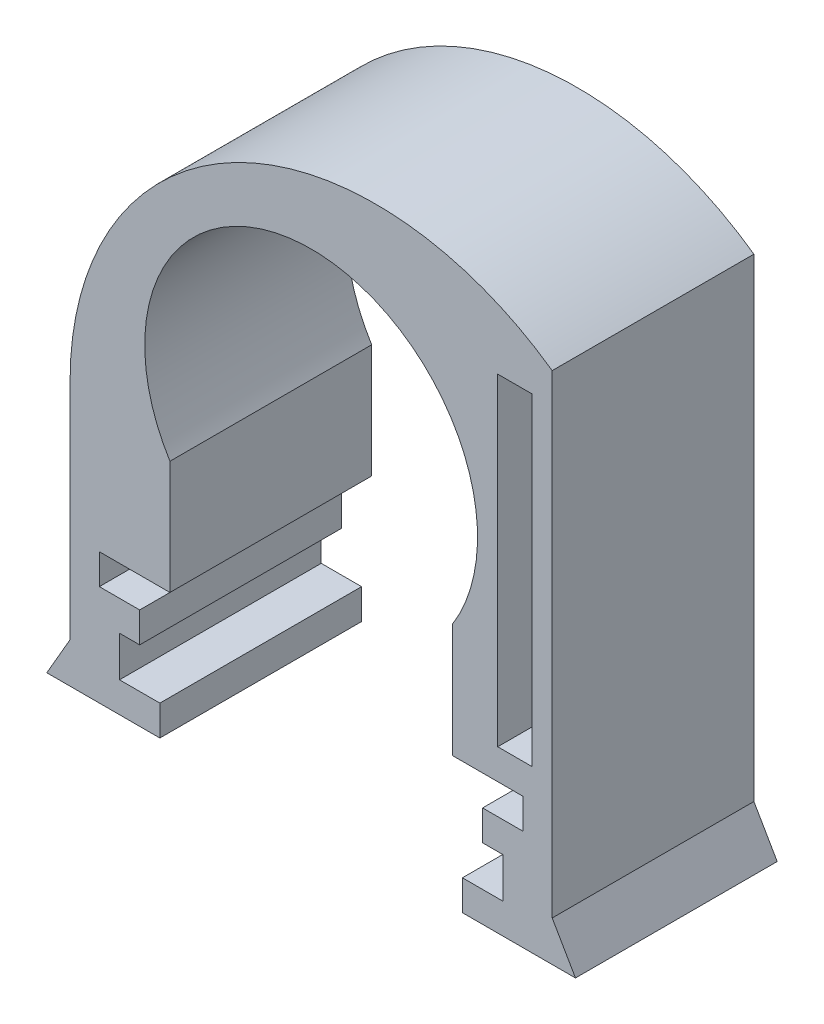
ISO-10303-21;
HEADER;
FILE_DESCRIPTION(('STEP AP214'),'2;1');
FILE_NAME('part.step','',(''),(''),'','','');
FILE_SCHEMA(('AUTOMOTIVE_DESIGN { 1 0 10303 214 1 1 1 1 }'));
ENDSEC;
DATA;
#1=APPLICATION_CONTEXT('core data for automotive mechanical design processes');
#2=APPLICATION_PROTOCOL_DEFINITION('international standard','automotive_design',2000,#1);
#3=PRODUCT_CONTEXT('',#1,'mechanical');
#4=PRODUCT('Part','Part','',(#3));
#5=PRODUCT_RELATED_PRODUCT_CATEGORY('part','',(#4));
#6=PRODUCT_DEFINITION_FORMATION('','',#4);
#7=PRODUCT_DEFINITION_CONTEXT('part definition',#1,'design');
#8=PRODUCT_DEFINITION('design','',#6,#7);
#9=PRODUCT_DEFINITION_SHAPE('','',#8);
#10=(LENGTH_UNIT() NAMED_UNIT(*) SI_UNIT(.MILLI.,.METRE.));
#11=(NAMED_UNIT(*) PLANE_ANGLE_UNIT() SI_UNIT($,.RADIAN.));
#12=(NAMED_UNIT(*) SI_UNIT($,.STERADIAN.) SOLID_ANGLE_UNIT());
#13=UNCERTAINTY_MEASURE_WITH_UNIT(LENGTH_MEASURE(1.E-05),#10,'distance_accuracy_value','');
#14=(GEOMETRIC_REPRESENTATION_CONTEXT(3) GLOBAL_UNCERTAINTY_ASSIGNED_CONTEXT((#13)) GLOBAL_UNIT_ASSIGNED_CONTEXT((#10,
#11,#12)) REPRESENTATION_CONTEXT('',''));
#15=CARTESIAN_POINT('',(0.,0.,0.));
#16=DIRECTION('',(0.,0.,1.));
#17=DIRECTION('',(1.,0.,0.));
#18=AXIS2_PLACEMENT_3D('',#15,#16,#17);
#19=CARTESIAN_POINT('',(11.95,-32.4920206421125,10.));
#20=DIRECTION('',(-1.,0.,0.));
#21=DIRECTION('',(0.,0.,1.));
#22=AXIS2_PLACEMENT_3D('',#19,#20,#21);
#23=PLANE('',#22);
#24=DIRECTION('',(0.,1.,0.));
#25=VECTOR('',#24,1.);
#26=CARTESIAN_POINT('',(11.95,-32.4920206421125,0.));
#27=LINE('',#26,#25);
#28=CARTESIAN_POINT('',(11.95,-14.5,0.));
#29=VERTEX_POINT('',#28);
#30=CARTESIAN_POINT('',(11.95,9.,0.));
#31=VERTEX_POINT('',#30);
#32=EDGE_CURVE('E278',#29,#31,#27,.T.);
#33=ORIENTED_EDGE('',*,*,#32,.T.);
#34=DIRECTION('',(0.,0.,-1.));
#35=VECTOR('',#34,1.);
#36=CARTESIAN_POINT('',(11.95,9.,10.));
#37=LINE('',#36,#35);
#38=CARTESIAN_POINT('',(11.95,9.,10.));
#39=VERTEX_POINT('',#38);
#40=EDGE_CURVE('E11',#39,#31,#37,.T.);
#41=ORIENTED_EDGE('',*,*,#40,.F.);
#42=DIRECTION('',(0.,1.,0.));
#43=VECTOR('',#42,1.);
#44=CARTESIAN_POINT('',(11.95,-32.4920206421125,10.));
#45=LINE('',#44,#43);
#46=CARTESIAN_POINT('',(11.95,-14.5,10.));
#47=VERTEX_POINT('',#46);
#48=EDGE_CURVE('E537',#47,#39,#45,.T.);
#49=ORIENTED_EDGE('',*,*,#48,.F.);
#50=DIRECTION('',(0.,0.,-1.));
#51=VECTOR('',#50,1.);
#52=CARTESIAN_POINT('',(11.95,-14.5,10.));
#53=LINE('',#52,#51);
#54=EDGE_CURVE('E344',#47,#29,#53,.T.);
#55=ORIENTED_EDGE('',*,*,#54,.T.);
#56=EDGE_LOOP('',(#33,#41,#49,#55));
#57=FACE_BOUND('',#56,.T.);
#58=ADVANCED_FACE('F33',(#57),#23,.F.);
#59=CARTESIAN_POINT('',(3.20553460715207,-3.37839061517565,10.));
#60=DIRECTION('',(0.,0.,-1.));
#61=DIRECTION('',(-1.,0.,0.));
#62=AXIS2_PLACEMENT_3D('',#59,#60,#61);
#63=CYLINDRICAL_SURFACE('',#62,15.1555346071521);
#64=CARTESIAN_POINT('',(3.20553460715207,-3.37839061517565,0.));
#65=DIRECTION('',(0.,0.,1.));
#66=DIRECTION('',(1.,0.,0.));
#67=AXIS2_PLACEMENT_3D('',#64,#65,#66);
#68=CIRCLE('',#67,15.1555346071521);
#69=CARTESIAN_POINT('',(-11.95,-3.37839061517565,0.));
#70=VERTEX_POINT('',#69);
#71=EDGE_CURVE('E281',#31,#70,#68,.T.);
#72=ORIENTED_EDGE('',*,*,#71,.T.);
#73=DIRECTION('',(0.,0.,-1.));
#74=VECTOR('',#73,1.);
#75=CARTESIAN_POINT('',(-11.95,-3.37839061517565,10.));
#76=LINE('',#75,#74);
#77=CARTESIAN_POINT('',(-11.95,-3.37839061517565,10.));
#78=VERTEX_POINT('',#77);
#79=EDGE_CURVE('E43',#78,#70,#76,.T.);
#80=ORIENTED_EDGE('',*,*,#79,.F.);
#81=CARTESIAN_POINT('',(3.20553460715207,-3.37839061517565,10.));
#82=DIRECTION('',(0.,0.,1.));
#83=DIRECTION('',(1.,0.,0.));
#84=AXIS2_PLACEMENT_3D('',#81,#82,#83);
#85=CIRCLE('',#84,15.1555346071521);
#86=EDGE_CURVE('E539',#39,#78,#85,.T.);
#87=ORIENTED_EDGE('',*,*,#86,.F.);
#88=ORIENTED_EDGE('',*,*,#40,.T.);
#89=EDGE_LOOP('',(#72,#80,#87,#88));
#90=FACE_BOUND('',#89,.T.);
#91=ADVANCED_FACE('F426',(#90),#63,.T.);
#92=CARTESIAN_POINT('',(-11.95,-32.4920206421125,10.));
#93=DIRECTION('',(-1.,0.,0.));
#94=DIRECTION('',(0.,-1.,0.));
#95=AXIS2_PLACEMENT_3D('',#92,#93,#94);
#96=PLANE('',#95);
#97=DIRECTION('',(0.,1.,0.));
#98=VECTOR('',#97,1.);
#99=CARTESIAN_POINT('',(-11.95,-32.4920206421125,0.));
#100=LINE('',#99,#98);
#101=CARTESIAN_POINT('',(-11.95,-14.5,0.));
#102=VERTEX_POINT('',#101);
#103=EDGE_CURVE('E284',#102,#70,#100,.T.);
#104=ORIENTED_EDGE('',*,*,#103,.F.);
#105=DIRECTION('',(0.,0.,-1.));
#106=VECTOR('',#105,1.);
#107=CARTESIAN_POINT('',(-11.95,-14.5,10.));
#108=LINE('',#107,#106);
#109=CARTESIAN_POINT('',(-11.95,-14.5,10.));
#110=VERTEX_POINT('',#109);
#111=EDGE_CURVE('E392',#110,#102,#108,.T.);
#112=ORIENTED_EDGE('',*,*,#111,.F.);
#113=DIRECTION('',(0.,1.,0.));
#114=VECTOR('',#113,1.);
#115=CARTESIAN_POINT('',(-11.95,-32.4920206421125,10.));
#116=LINE('',#115,#114);
#117=EDGE_CURVE('E541',#110,#78,#116,.T.);
#118=ORIENTED_EDGE('',*,*,#117,.T.);
#119=ORIENTED_EDGE('',*,*,#79,.T.);
#120=EDGE_LOOP('',(#104,#112,#118,#119));
#121=FACE_BOUND('',#120,.T.);
#122=ADVANCED_FACE('F432',(#121),#96,.T.);
#123=CARTESIAN_POINT('',(-16.7532734707417,-22.8195136939723,10.));
#124=DIRECTION('',(-0.866025403784437,0.500000000000004,0.));
#125=DIRECTION('',(-0.500000000000004,-0.866025403784437,0.));
#126=AXIS2_PLACEMENT_3D('',#123,#124,#125);
#127=PLANE('',#126);
#128=DIRECTION('',(0.500000000000004,0.866025403784437,0.));
#129=VECTOR('',#128,1.);
#130=CARTESIAN_POINT('',(-16.7532734707417,-22.8195136939723,0.));
#131=LINE('',#130,#129);
#132=CARTESIAN_POINT('',(-13.1047005383793,-16.5,0.));
#133=VERTEX_POINT('',#132);
#134=EDGE_CURVE('E287',#133,#102,#131,.T.);
#135=ORIENTED_EDGE('',*,*,#134,.F.);
#136=DIRECTION('',(0.,0.,-1.));
#137=VECTOR('',#136,1.);
#138=CARTESIAN_POINT('',(-13.1047005383793,-16.5,10.));
#139=LINE('',#138,#137);
#140=CARTESIAN_POINT('',(-13.1047005383793,-16.5,10.));
#141=VERTEX_POINT('',#140);
#142=EDGE_CURVE('E390',#141,#133,#139,.T.);
#143=ORIENTED_EDGE('',*,*,#142,.F.);
#144=DIRECTION('',(0.500000000000004,0.866025403784437,0.));
#145=VECTOR('',#144,1.);
#146=CARTESIAN_POINT('',(-16.7532734707417,-22.8195136939723,10.));
#147=LINE('',#146,#145);
#148=EDGE_CURVE('E544',#141,#110,#147,.T.);
#149=ORIENTED_EDGE('',*,*,#148,.T.);
#150=ORIENTED_EDGE('',*,*,#111,.T.);
#151=EDGE_LOOP('',(#135,#143,#149,#150));
#152=FACE_BOUND('',#151,.T.);
#153=ADVANCED_FACE('F438',(#152),#127,.T.);
#154=CARTESIAN_POINT('',(0.,-16.5,10.));
#155=DIRECTION('',(0.,-1.,0.));
#156=DIRECTION('',(0.,0.,-1.));
#157=AXIS2_PLACEMENT_3D('',#154,#155,#156);
#158=PLANE('',#157);
#159=DIRECTION('',(-1.,0.,0.));
#160=VECTOR('',#159,1.);
#161=CARTESIAN_POINT('',(0.,-16.5,0.));
#162=LINE('',#161,#160);
#163=CARTESIAN_POINT('',(-7.5,-16.5,0.));
#164=VERTEX_POINT('',#163);
#165=EDGE_CURVE('E290',#164,#133,#162,.T.);
#166=ORIENTED_EDGE('',*,*,#165,.F.);
#167=DIRECTION('',(0.,0.,-1.));
#168=VECTOR('',#167,1.);
#169=CARTESIAN_POINT('',(-7.5,-16.5,10.));
#170=LINE('',#169,#168);
#171=CARTESIAN_POINT('',(-7.5,-16.5,10.));
#172=VERTEX_POINT('',#171);
#173=EDGE_CURVE('E388',#172,#164,#170,.T.);
#174=ORIENTED_EDGE('',*,*,#173,.F.);
#175=DIRECTION('',(-1.,0.,0.));
#176=VECTOR('',#175,1.);
#177=CARTESIAN_POINT('',(0.,-16.5,10.));
#178=LINE('',#177,#176);
#179=EDGE_CURVE('E547',#172,#141,#178,.T.);
#180=ORIENTED_EDGE('',*,*,#179,.T.);
#181=ORIENTED_EDGE('',*,*,#142,.T.);
#182=EDGE_LOOP('',(#166,#174,#180,#181));
#183=FACE_BOUND('',#182,.T.);
#184=ADVANCED_FACE('F442',(#183),#158,.T.);
#185=CARTESIAN_POINT('',(-7.5,-32.4920206421125,10.));
#186=DIRECTION('',(1.,0.,0.));
#187=DIRECTION('',(0.,0.,-1.));
#188=AXIS2_PLACEMENT_3D('',#185,#186,#187);
#189=PLANE('',#188);
#190=DIRECTION('',(0.,-1.,0.));
#191=VECTOR('',#190,1.);
#192=CARTESIAN_POINT('',(-7.5,-32.4920206421125,0.));
#193=LINE('',#192,#191);
#194=CARTESIAN_POINT('',(-7.5,-15.,0.));
#195=VERTEX_POINT('',#194);
#196=EDGE_CURVE('E293',#195,#164,#193,.T.);
#197=ORIENTED_EDGE('',*,*,#196,.F.);
#198=DIRECTION('',(0.,0.,-1.));
#199=VECTOR('',#198,1.);
#200=CARTESIAN_POINT('',(-7.5,-15.,10.));
#201=LINE('',#200,#199);
#202=CARTESIAN_POINT('',(-7.5,-15.,10.));
#203=VERTEX_POINT('',#202);
#204=EDGE_CURVE('E386',#203,#195,#201,.T.);
#205=ORIENTED_EDGE('',*,*,#204,.F.);
#206=DIRECTION('',(0.,-1.,0.));
#207=VECTOR('',#206,1.);
#208=CARTESIAN_POINT('',(-7.5,-32.4920206421125,10.));
#209=LINE('',#208,#207);
#210=EDGE_CURVE('E550',#203,#172,#209,.T.);
#211=ORIENTED_EDGE('',*,*,#210,.T.);
#212=ORIENTED_EDGE('',*,*,#173,.T.);
#213=EDGE_LOOP('',(#197,#205,#211,#212));
#214=FACE_BOUND('',#213,.T.);
#215=ADVANCED_FACE('F446',(#214),#189,.T.);
#216=CARTESIAN_POINT('',(0.,-15.,10.));
#217=DIRECTION('',(0.,1.,0.));
#218=DIRECTION('',(0.,0.,1.));
#219=AXIS2_PLACEMENT_3D('',#216,#217,#218);
#220=PLANE('',#219);
#221=DIRECTION('',(1.,0.,0.));
#222=VECTOR('',#221,1.);
#223=CARTESIAN_POINT('',(0.,-15.,0.));
#224=LINE('',#223,#222);
#225=CARTESIAN_POINT('',(-9.5,-15.,0.));
#226=VERTEX_POINT('',#225);
#227=EDGE_CURVE('E296',#226,#195,#224,.T.);
#228=ORIENTED_EDGE('',*,*,#227,.F.);
#229=DIRECTION('',(0.,0.,-1.));
#230=VECTOR('',#229,1.);
#231=CARTESIAN_POINT('',(-9.5,-15.,10.));
#232=LINE('',#231,#230);
#233=CARTESIAN_POINT('',(-9.5,-15.,10.));
#234=VERTEX_POINT('',#233);
#235=EDGE_CURVE('E384',#234,#226,#232,.T.);
#236=ORIENTED_EDGE('',*,*,#235,.F.);
#237=DIRECTION('',(1.,0.,0.));
#238=VECTOR('',#237,1.);
#239=CARTESIAN_POINT('',(0.,-15.,10.));
#240=LINE('',#239,#238);
#241=EDGE_CURVE('E553',#234,#203,#240,.T.);
#242=ORIENTED_EDGE('',*,*,#241,.T.);
#243=ORIENTED_EDGE('',*,*,#204,.T.);
#244=EDGE_LOOP('',(#228,#236,#242,#243));
#245=FACE_BOUND('',#244,.T.);
#246=ADVANCED_FACE('F450',(#245),#220,.T.);
#247=CARTESIAN_POINT('',(-9.5,-32.4920206421125,10.));
#248=DIRECTION('',(1.,0.,0.));
#249=DIRECTION('',(0.,0.,-1.));
#250=AXIS2_PLACEMENT_3D('',#247,#248,#249);
#251=PLANE('',#250);
#252=DIRECTION('',(0.,-1.,0.));
#253=VECTOR('',#252,1.);
#254=CARTESIAN_POINT('',(-9.5,-32.4920206421125,0.));
#255=LINE('',#254,#253);
#256=CARTESIAN_POINT('',(-9.5,-13.,0.));
#257=VERTEX_POINT('',#256);
#258=EDGE_CURVE('E299',#257,#226,#255,.T.);
#259=ORIENTED_EDGE('',*,*,#258,.F.);
#260=DIRECTION('',(0.,0.,-1.));
#261=VECTOR('',#260,1.);
#262=CARTESIAN_POINT('',(-9.5,-13.,10.));
#263=LINE('',#262,#261);
#264=CARTESIAN_POINT('',(-9.5,-13.,10.));
#265=VERTEX_POINT('',#264);
#266=EDGE_CURVE('E382',#265,#257,#263,.T.);
#267=ORIENTED_EDGE('',*,*,#266,.F.);
#268=DIRECTION('',(0.,-1.,0.));
#269=VECTOR('',#268,1.);
#270=CARTESIAN_POINT('',(-9.5,-32.4920206421125,10.));
#271=LINE('',#270,#269);
#272=EDGE_CURVE('E556',#265,#234,#271,.T.);
#273=ORIENTED_EDGE('',*,*,#272,.T.);
#274=ORIENTED_EDGE('',*,*,#235,.T.);
#275=EDGE_LOOP('',(#259,#267,#273,#274));
#276=FACE_BOUND('',#275,.T.);
#277=ADVANCED_FACE('F454',(#276),#251,.T.);
#278=CARTESIAN_POINT('',(0.,-13.,10.));
#279=DIRECTION('',(0.,-1.,0.));
#280=DIRECTION('',(0.,0.,-1.));
#281=AXIS2_PLACEMENT_3D('',#278,#279,#280);
#282=PLANE('',#281);
#283=DIRECTION('',(-1.,0.,0.));
#284=VECTOR('',#283,1.);
#285=CARTESIAN_POINT('',(0.,-13.,0.));
#286=LINE('',#285,#284);
#287=CARTESIAN_POINT('',(-8.5,-13.,0.));
#288=VERTEX_POINT('',#287);
#289=EDGE_CURVE('E302',#288,#257,#286,.T.);
#290=ORIENTED_EDGE('',*,*,#289,.F.);
#291=DIRECTION('',(0.,0.,-1.));
#292=VECTOR('',#291,1.);
#293=CARTESIAN_POINT('',(-8.5,-13.,10.));
#294=LINE('',#293,#292);
#295=CARTESIAN_POINT('',(-8.5,-13.,10.));
#296=VERTEX_POINT('',#295);
#297=EDGE_CURVE('E380',#296,#288,#294,.T.);
#298=ORIENTED_EDGE('',*,*,#297,.F.);
#299=DIRECTION('',(-1.,0.,0.));
#300=VECTOR('',#299,1.);
#301=CARTESIAN_POINT('',(0.,-13.,10.));
#302=LINE('',#301,#300);
#303=EDGE_CURVE('E559',#296,#265,#302,.T.);
#304=ORIENTED_EDGE('',*,*,#303,.T.);
#305=ORIENTED_EDGE('',*,*,#266,.T.);
#306=EDGE_LOOP('',(#290,#298,#304,#305));
#307=FACE_BOUND('',#306,.T.);
#308=ADVANCED_FACE('F458',(#307),#282,.T.);
#309=CARTESIAN_POINT('',(-8.5,-32.4920206421125,10.));
#310=DIRECTION('',(-1.,0.,0.));
#311=DIRECTION('',(0.,0.,1.));
#312=AXIS2_PLACEMENT_3D('',#309,#310,#311);
#313=PLANE('',#312);
#314=DIRECTION('',(0.,1.,0.));
#315=VECTOR('',#314,1.);
#316=CARTESIAN_POINT('',(-8.5,-32.4920206421125,0.));
#317=LINE('',#316,#315);
#318=CARTESIAN_POINT('',(-8.5,-11.5,0.));
#319=VERTEX_POINT('',#318);
#320=EDGE_CURVE('E305',#288,#319,#317,.T.);
#321=ORIENTED_EDGE('',*,*,#320,.T.);
#322=DIRECTION('',(0.,0.,-1.));
#323=VECTOR('',#322,1.);
#324=CARTESIAN_POINT('',(-8.5,-11.5,10.));
#325=LINE('',#324,#323);
#326=CARTESIAN_POINT('',(-8.5,-11.5,10.));
#327=VERTEX_POINT('',#326);
#328=EDGE_CURVE('E377',#327,#319,#325,.T.);
#329=ORIENTED_EDGE('',*,*,#328,.F.);
#330=DIRECTION('',(0.,1.,0.));
#331=VECTOR('',#330,1.);
#332=CARTESIAN_POINT('',(-8.5,-32.4920206421125,10.));
#333=LINE('',#332,#331);
#334=EDGE_CURVE('E562',#296,#327,#333,.T.);
#335=ORIENTED_EDGE('',*,*,#334,.F.);
#336=ORIENTED_EDGE('',*,*,#297,.T.);
#337=EDGE_LOOP('',(#321,#329,#335,#336));
#338=FACE_BOUND('',#337,.T.);
#339=ADVANCED_FACE('F462',(#338),#313,.F.);
#340=CARTESIAN_POINT('',(0.,-11.5,10.));
#341=DIRECTION('',(0.,-1.,0.));
#342=DIRECTION('',(0.,0.,-1.));
#343=AXIS2_PLACEMENT_3D('',#340,#341,#342);
#344=PLANE('',#343);
#345=DIRECTION('',(-1.,0.,0.));
#346=VECTOR('',#345,1.);
#347=CARTESIAN_POINT('',(0.,-11.5,0.));
#348=LINE('',#347,#346);
#349=CARTESIAN_POINT('',(-10.5,-11.5,0.));
#350=VERTEX_POINT('',#349);
#351=EDGE_CURVE('E307',#319,#350,#348,.T.);
#352=ORIENTED_EDGE('',*,*,#351,.T.);
#353=DIRECTION('',(0.,0.,-1.));
#354=VECTOR('',#353,1.);
#355=CARTESIAN_POINT('',(-10.5,-11.5,10.));
#356=LINE('',#355,#354);
#357=CARTESIAN_POINT('',(-10.5,-11.5,10.));
#358=VERTEX_POINT('',#357);
#359=EDGE_CURVE('E374',#358,#350,#356,.T.);
#360=ORIENTED_EDGE('',*,*,#359,.F.);
#361=DIRECTION('',(-1.,0.,0.));
#362=VECTOR('',#361,1.);
#363=CARTESIAN_POINT('',(0.,-11.5,10.));
#364=LINE('',#363,#362);
#365=EDGE_CURVE('E564',#327,#358,#364,.T.);
#366=ORIENTED_EDGE('',*,*,#365,.F.);
#367=ORIENTED_EDGE('',*,*,#328,.T.);
#368=EDGE_LOOP('',(#352,#360,#366,#367));
#369=FACE_BOUND('',#368,.T.);
#370=ADVANCED_FACE('F466',(#369),#344,.F.);
#371=CARTESIAN_POINT('',(-10.5,-32.4920206421125,10.));
#372=DIRECTION('',(-1.,0.,0.));
#373=DIRECTION('',(0.,-1.,0.));
#374=AXIS2_PLACEMENT_3D('',#371,#372,#373);
#375=PLANE('',#374);
#376=DIRECTION('',(0.,1.,0.));
#377=VECTOR('',#376,1.);
#378=CARTESIAN_POINT('',(-10.5,-32.4920206421125,0.));
#379=LINE('',#378,#377);
#380=CARTESIAN_POINT('',(-10.5,-10.,0.));
#381=VERTEX_POINT('',#380);
#382=EDGE_CURVE('E309',#350,#381,#379,.T.);
#383=ORIENTED_EDGE('',*,*,#382,.T.);
#384=DIRECTION('',(0.,0.,-1.));
#385=VECTOR('',#384,1.);
#386=CARTESIAN_POINT('',(-10.5,-10.,10.));
#387=LINE('',#386,#385);
#388=CARTESIAN_POINT('',(-10.5,-10.,10.));
#389=VERTEX_POINT('',#388);
#390=EDGE_CURVE('E371',#389,#381,#387,.T.);
#391=ORIENTED_EDGE('',*,*,#390,.F.);
#392=DIRECTION('',(0.,1.,0.));
#393=VECTOR('',#392,1.);
#394=CARTESIAN_POINT('',(-10.5,-32.4920206421125,10.));
#395=LINE('',#394,#393);
#396=EDGE_CURVE('E566',#358,#389,#395,.T.);
#397=ORIENTED_EDGE('',*,*,#396,.F.);
#398=ORIENTED_EDGE('',*,*,#359,.T.);
#399=EDGE_LOOP('',(#383,#391,#397,#398));
#400=FACE_BOUND('',#399,.T.);
#401=ADVANCED_FACE('F470',(#400),#375,.F.);
#402=CARTESIAN_POINT('',(0.,-10.,10.));
#403=DIRECTION('',(0.,1.,0.));
#404=DIRECTION('',(0.,0.,1.));
#405=AXIS2_PLACEMENT_3D('',#402,#403,#404);
#406=PLANE('',#405);
#407=DIRECTION('',(1.,0.,0.));
#408=VECTOR('',#407,1.);
#409=CARTESIAN_POINT('',(0.,-10.,0.));
#410=LINE('',#409,#408);
#411=CARTESIAN_POINT('',(-7.,-10.,0.));
#412=VERTEX_POINT('',#411);
#413=EDGE_CURVE('E311',#381,#412,#410,.T.);
#414=ORIENTED_EDGE('',*,*,#413,.T.);
#415=DIRECTION('',(0.,0.,-1.));
#416=VECTOR('',#415,1.);
#417=CARTESIAN_POINT('',(-7.,-10.,10.));
#418=LINE('',#417,#416);
#419=CARTESIAN_POINT('',(-7.,-10.,10.));
#420=VERTEX_POINT('',#419);
#421=EDGE_CURVE('E368',#420,#412,#418,.T.);
#422=ORIENTED_EDGE('',*,*,#421,.F.);
#423=DIRECTION('',(1.,0.,0.));
#424=VECTOR('',#423,1.);
#425=CARTESIAN_POINT('',(0.,-10.,10.));
#426=LINE('',#425,#424);
#427=EDGE_CURVE('E568',#389,#420,#426,.T.);
#428=ORIENTED_EDGE('',*,*,#427,.F.);
#429=ORIENTED_EDGE('',*,*,#390,.T.);
#430=EDGE_LOOP('',(#414,#422,#428,#429));
#431=FACE_BOUND('',#430,.T.);
#432=ADVANCED_FACE('F474',(#431),#406,.F.);
#433=CARTESIAN_POINT('',(-7.,-32.4920206421125,10.));
#434=DIRECTION('',(-1.,0.,0.));
#435=DIRECTION('',(0.,0.,1.));
#436=AXIS2_PLACEMENT_3D('',#433,#434,#435);
#437=PLANE('',#436);
#438=DIRECTION('',(0.,1.,0.));
#439=VECTOR('',#438,1.);
#440=CARTESIAN_POINT('',(-7.,-32.4920206421125,0.));
#441=LINE('',#440,#439);
#442=CARTESIAN_POINT('',(-7.,-4.36606229914325,0.));
#443=VERTEX_POINT('',#442);
#444=EDGE_CURVE('E313',#412,#443,#441,.T.);
#445=ORIENTED_EDGE('',*,*,#444,.T.);
#446=DIRECTION('',(0.,0.,-1.));
#447=VECTOR('',#446,1.);
#448=CARTESIAN_POINT('',(-7.,-4.36606229914325,10.));
#449=LINE('',#448,#447);
#450=CARTESIAN_POINT('',(-7.,-4.36606229914325,10.));
#451=VERTEX_POINT('',#450);
#452=EDGE_CURVE('E366',#451,#443,#449,.T.);
#453=ORIENTED_EDGE('',*,*,#452,.F.);
#454=DIRECTION('',(0.,1.,0.));
#455=VECTOR('',#454,1.);
#456=CARTESIAN_POINT('',(-7.,-32.4920206421125,10.));
#457=LINE('',#456,#455);
#458=EDGE_CURVE('E570',#420,#451,#457,.T.);
#459=ORIENTED_EDGE('',*,*,#458,.F.);
#460=ORIENTED_EDGE('',*,*,#421,.T.);
#461=EDGE_LOOP('',(#445,#453,#459,#460));
#462=FACE_BOUND('',#461,.T.);
#463=ADVANCED_FACE('F478',(#462),#437,.F.);
#464=CARTESIAN_POINT('',(0.,0.,10.));
#465=DIRECTION('',(0.,0.,-1.));
#466=DIRECTION('',(-1.,0.,0.));
#467=AXIS2_PLACEMENT_3D('',#464,#465,#466);
#468=CYLINDRICAL_SURFACE('',#467,8.25);
#469=CARTESIAN_POINT('',(0.,0.,0.));
#470=DIRECTION('',(0.,0.,1.));
#471=DIRECTION('',(1.,0.,0.));
#472=AXIS2_PLACEMENT_3D('',#469,#470,#471);
#473=CIRCLE('',#472,8.25);
#474=CARTESIAN_POINT('',(7.,-4.36606229914325,0.));
#475=VERTEX_POINT('',#474);
#476=EDGE_CURVE('E316',#475,#443,#473,.T.);
#477=ORIENTED_EDGE('',*,*,#476,.F.);
#478=DIRECTION('',(0.,0.,-1.));
#479=VECTOR('',#478,1.);
#480=CARTESIAN_POINT('',(7.,-4.36606229914325,10.));
#481=LINE('',#480,#479);
#482=CARTESIAN_POINT('',(7.,-4.36606229914325,10.));
#483=VERTEX_POINT('',#482);
#484=EDGE_CURVE('E364',#483,#475,#481,.T.);
#485=ORIENTED_EDGE('',*,*,#484,.F.);
#486=CARTESIAN_POINT('',(0.,0.,10.));
#487=DIRECTION('',(0.,0.,1.));
#488=DIRECTION('',(1.,0.,0.));
#489=AXIS2_PLACEMENT_3D('',#486,#487,#488);
#490=CIRCLE('',#489,8.25);
#491=EDGE_CURVE('E572',#483,#451,#490,.T.);
#492=ORIENTED_EDGE('',*,*,#491,.T.);
#493=ORIENTED_EDGE('',*,*,#452,.T.);
#494=EDGE_LOOP('',(#477,#485,#492,#493));
#495=FACE_BOUND('',#494,.T.);
#496=ADVANCED_FACE('F482',(#495),#468,.F.);
#497=CARTESIAN_POINT('',(7.,-32.4920206421125,10.));
#498=DIRECTION('',(-1.,0.,0.));
#499=DIRECTION('',(0.,0.,1.));
#500=AXIS2_PLACEMENT_3D('',#497,#498,#499);
#501=PLANE('',#500);
#502=DIRECTION('',(0.,1.,0.));
#503=VECTOR('',#502,1.);
#504=CARTESIAN_POINT('',(7.,-32.4920206421125,0.));
#505=LINE('',#504,#503);
#506=CARTESIAN_POINT('',(7.,-10.,0.));
#507=VERTEX_POINT('',#506);
#508=EDGE_CURVE('E319',#507,#475,#505,.T.);
#509=ORIENTED_EDGE('',*,*,#508,.F.);
#510=DIRECTION('',(0.,0.,-1.));
#511=VECTOR('',#510,1.);
#512=CARTESIAN_POINT('',(7.,-10.,10.));
#513=LINE('',#512,#511);
#514=CARTESIAN_POINT('',(7.,-10.,10.));
#515=VERTEX_POINT('',#514);
#516=EDGE_CURVE('E362',#515,#507,#513,.T.);
#517=ORIENTED_EDGE('',*,*,#516,.F.);
#518=DIRECTION('',(0.,1.,0.));
#519=VECTOR('',#518,1.);
#520=CARTESIAN_POINT('',(7.,-32.4920206421125,10.));
#521=LINE('',#520,#519);
#522=EDGE_CURVE('E575',#515,#483,#521,.T.);
#523=ORIENTED_EDGE('',*,*,#522,.T.);
#524=ORIENTED_EDGE('',*,*,#484,.T.);
#525=EDGE_LOOP('',(#509,#517,#523,#524));
#526=FACE_BOUND('',#525,.T.);
#527=ADVANCED_FACE('F486',(#526),#501,.T.);
#528=CARTESIAN_POINT('',(0.,-10.,10.));
#529=DIRECTION('',(0.,-1.,0.));
#530=DIRECTION('',(0.,0.,-1.));
#531=AXIS2_PLACEMENT_3D('',#528,#529,#530);
#532=PLANE('',#531);
#533=DIRECTION('',(-1.,0.,0.));
#534=VECTOR('',#533,1.);
#535=CARTESIAN_POINT('',(0.,-10.,0.));
#536=LINE('',#535,#534);
#537=CARTESIAN_POINT('',(10.5,-10.,0.));
#538=VERTEX_POINT('',#537);
#539=EDGE_CURVE('E322',#538,#507,#536,.T.);
#540=ORIENTED_EDGE('',*,*,#539,.F.);
#541=DIRECTION('',(0.,0.,-1.));
#542=VECTOR('',#541,1.);
#543=CARTESIAN_POINT('',(10.5,-10.,10.));
#544=LINE('',#543,#542);
#545=CARTESIAN_POINT('',(10.5,-10.,10.));
#546=VERTEX_POINT('',#545);
#547=EDGE_CURVE('E360',#546,#538,#544,.T.);
#548=ORIENTED_EDGE('',*,*,#547,.F.);
#549=DIRECTION('',(-1.,0.,0.));
#550=VECTOR('',#549,1.);
#551=CARTESIAN_POINT('',(0.,-10.,10.));
#552=LINE('',#551,#550);
#553=EDGE_CURVE('E578',#546,#515,#552,.T.);
#554=ORIENTED_EDGE('',*,*,#553,.T.);
#555=ORIENTED_EDGE('',*,*,#516,.T.);
#556=EDGE_LOOP('',(#540,#548,#554,#555));
#557=FACE_BOUND('',#556,.T.);
#558=ADVANCED_FACE('F490',(#557),#532,.T.);
#559=CARTESIAN_POINT('',(10.5,-32.4920206421125,10.));
#560=DIRECTION('',(-1.,0.,0.));
#561=DIRECTION('',(0.,-1.,0.));
#562=AXIS2_PLACEMENT_3D('',#559,#560,#561);
#563=PLANE('',#562);
#564=DIRECTION('',(0.,1.,0.));
#565=VECTOR('',#564,1.);
#566=CARTESIAN_POINT('',(10.5,-32.4920206421125,0.));
#567=LINE('',#566,#565);
#568=CARTESIAN_POINT('',(10.5,-11.5,0.));
#569=VERTEX_POINT('',#568);
#570=EDGE_CURVE('E325',#569,#538,#567,.T.);
#571=ORIENTED_EDGE('',*,*,#570,.F.);
#572=DIRECTION('',(0.,0.,-1.));
#573=VECTOR('',#572,1.);
#574=CARTESIAN_POINT('',(10.5,-11.5,10.));
#575=LINE('',#574,#573);
#576=CARTESIAN_POINT('',(10.5,-11.5,10.));
#577=VERTEX_POINT('',#576);
#578=EDGE_CURVE('E358',#577,#569,#575,.T.);
#579=ORIENTED_EDGE('',*,*,#578,.F.);
#580=DIRECTION('',(0.,1.,0.));
#581=VECTOR('',#580,1.);
#582=CARTESIAN_POINT('',(10.5,-32.4920206421125,10.));
#583=LINE('',#582,#581);
#584=EDGE_CURVE('E581',#577,#546,#583,.T.);
#585=ORIENTED_EDGE('',*,*,#584,.T.);
#586=ORIENTED_EDGE('',*,*,#547,.T.);
#587=EDGE_LOOP('',(#571,#579,#585,#586));
#588=FACE_BOUND('',#587,.T.);
#589=ADVANCED_FACE('F494',(#588),#563,.T.);
#590=CARTESIAN_POINT('',(0.,-11.5,10.));
#591=DIRECTION('',(0.,1.,0.));
#592=DIRECTION('',(0.,0.,1.));
#593=AXIS2_PLACEMENT_3D('',#590,#591,#592);
#594=PLANE('',#593);
#595=DIRECTION('',(1.,0.,0.));
#596=VECTOR('',#595,1.);
#597=CARTESIAN_POINT('',(0.,-11.5,0.));
#598=LINE('',#597,#596);
#599=CARTESIAN_POINT('',(8.5,-11.5,0.));
#600=VERTEX_POINT('',#599);
#601=EDGE_CURVE('E328',#600,#569,#598,.T.);
#602=ORIENTED_EDGE('',*,*,#601,.F.);
#603=DIRECTION('',(0.,0.,-1.));
#604=VECTOR('',#603,1.);
#605=CARTESIAN_POINT('',(8.5,-11.5,10.));
#606=LINE('',#605,#604);
#607=CARTESIAN_POINT('',(8.5,-11.5,10.));
#608=VERTEX_POINT('',#607);
#609=EDGE_CURVE('E356',#608,#600,#606,.T.);
#610=ORIENTED_EDGE('',*,*,#609,.F.);
#611=DIRECTION('',(1.,0.,0.));
#612=VECTOR('',#611,1.);
#613=CARTESIAN_POINT('',(0.,-11.5,10.));
#614=LINE('',#613,#612);
#615=EDGE_CURVE('E584',#608,#577,#614,.T.);
#616=ORIENTED_EDGE('',*,*,#615,.T.);
#617=ORIENTED_EDGE('',*,*,#578,.T.);
#618=EDGE_LOOP('',(#602,#610,#616,#617));
#619=FACE_BOUND('',#618,.T.);
#620=ADVANCED_FACE('F498',(#619),#594,.T.);
#621=CARTESIAN_POINT('',(8.5,-32.4920206421125,10.));
#622=DIRECTION('',(-1.,0.,0.));
#623=DIRECTION('',(0.,0.,1.));
#624=AXIS2_PLACEMENT_3D('',#621,#622,#623);
#625=PLANE('',#624);
#626=DIRECTION('',(0.,1.,0.));
#627=VECTOR('',#626,1.);
#628=CARTESIAN_POINT('',(8.5,-32.4920206421125,0.));
#629=LINE('',#628,#627);
#630=CARTESIAN_POINT('',(8.5,-13.,0.));
#631=VERTEX_POINT('',#630);
#632=EDGE_CURVE('E331',#631,#600,#629,.T.);
#633=ORIENTED_EDGE('',*,*,#632,.F.);
#634=DIRECTION('',(0.,0.,-1.));
#635=VECTOR('',#634,1.);
#636=CARTESIAN_POINT('',(8.5,-13.,10.));
#637=LINE('',#636,#635);
#638=CARTESIAN_POINT('',(8.5,-13.,10.));
#639=VERTEX_POINT('',#638);
#640=EDGE_CURVE('E354',#639,#631,#637,.T.);
#641=ORIENTED_EDGE('',*,*,#640,.F.);
#642=DIRECTION('',(0.,1.,0.));
#643=VECTOR('',#642,1.);
#644=CARTESIAN_POINT('',(8.5,-32.4920206421125,10.));
#645=LINE('',#644,#643);
#646=EDGE_CURVE('E587',#639,#608,#645,.T.);
#647=ORIENTED_EDGE('',*,*,#646,.T.);
#648=ORIENTED_EDGE('',*,*,#609,.T.);
#649=EDGE_LOOP('',(#633,#641,#647,#648));
#650=FACE_BOUND('',#649,.T.);
#651=ADVANCED_FACE('F502',(#650),#625,.T.);
#652=CARTESIAN_POINT('',(0.,-13.,10.));
#653=DIRECTION('',(0.,1.,0.));
#654=DIRECTION('',(0.,0.,1.));
#655=AXIS2_PLACEMENT_3D('',#652,#653,#654);
#656=PLANE('',#655);
#657=DIRECTION('',(1.,0.,0.));
#658=VECTOR('',#657,1.);
#659=CARTESIAN_POINT('',(0.,-13.,0.));
#660=LINE('',#659,#658);
#661=CARTESIAN_POINT('',(9.5,-13.,0.));
#662=VERTEX_POINT('',#661);
#663=EDGE_CURVE('E334',#631,#662,#660,.T.);
#664=ORIENTED_EDGE('',*,*,#663,.T.);
#665=DIRECTION('',(0.,0.,-1.));
#666=VECTOR('',#665,1.);
#667=CARTESIAN_POINT('',(9.5,-13.,10.));
#668=LINE('',#667,#666);
#669=CARTESIAN_POINT('',(9.5,-13.,10.));
#670=VERTEX_POINT('',#669);
#671=EDGE_CURVE('E351',#670,#662,#668,.T.);
#672=ORIENTED_EDGE('',*,*,#671,.F.);
#673=DIRECTION('',(1.,0.,0.));
#674=VECTOR('',#673,1.);
#675=CARTESIAN_POINT('',(0.,-13.,10.));
#676=LINE('',#675,#674);
#677=EDGE_CURVE('E590',#639,#670,#676,.T.);
#678=ORIENTED_EDGE('',*,*,#677,.F.);
#679=ORIENTED_EDGE('',*,*,#640,.T.);
#680=EDGE_LOOP('',(#664,#672,#678,#679));
#681=FACE_BOUND('',#680,.T.);
#682=ADVANCED_FACE('F506',(#681),#656,.F.);
#683=CARTESIAN_POINT('',(9.5,-32.4920206421125,10.));
#684=DIRECTION('',(1.,0.,0.));
#685=DIRECTION('',(0.,0.,-1.));
#686=AXIS2_PLACEMENT_3D('',#683,#684,#685);
#687=PLANE('',#686);
#688=DIRECTION('',(0.,-1.,0.));
#689=VECTOR('',#688,1.);
#690=CARTESIAN_POINT('',(9.5,-32.4920206421125,0.));
#691=LINE('',#690,#689);
#692=CARTESIAN_POINT('',(9.5,-15.,0.));
#693=VERTEX_POINT('',#692);
#694=EDGE_CURVE('E336',#662,#693,#691,.T.);
#695=ORIENTED_EDGE('',*,*,#694,.T.);
#696=DIRECTION('',(0.,0.,-1.));
#697=VECTOR('',#696,1.);
#698=CARTESIAN_POINT('',(9.5,-15.,10.));
#699=LINE('',#698,#697);
#700=CARTESIAN_POINT('',(9.5,-15.,10.));
#701=VERTEX_POINT('',#700);
#702=EDGE_CURVE('E348',#701,#693,#699,.T.);
#703=ORIENTED_EDGE('',*,*,#702,.F.);
#704=DIRECTION('',(0.,-1.,0.));
#705=VECTOR('',#704,1.);
#706=CARTESIAN_POINT('',(9.5,-32.4920206421125,10.));
#707=LINE('',#706,#705);
#708=EDGE_CURVE('E592',#670,#701,#707,.T.);
#709=ORIENTED_EDGE('',*,*,#708,.F.);
#710=ORIENTED_EDGE('',*,*,#671,.T.);
#711=EDGE_LOOP('',(#695,#703,#709,#710));
#712=FACE_BOUND('',#711,.T.);
#713=ADVANCED_FACE('F510',(#712),#687,.F.);
#714=CARTESIAN_POINT('',(0.,-15.,10.));
#715=DIRECTION('',(0.,-1.,0.));
#716=DIRECTION('',(0.,0.,-1.));
#717=AXIS2_PLACEMENT_3D('',#714,#715,#716);
#718=PLANE('',#717);
#719=DIRECTION('',(-1.,0.,0.));
#720=VECTOR('',#719,1.);
#721=CARTESIAN_POINT('',(0.,-15.,0.));
#722=LINE('',#721,#720);
#723=CARTESIAN_POINT('',(7.5,-15.,0.));
#724=VERTEX_POINT('',#723);
#725=EDGE_CURVE('E338',#693,#724,#722,.T.);
#726=ORIENTED_EDGE('',*,*,#725,.T.);
#727=DIRECTION('',(0.,0.,-1.));
#728=VECTOR('',#727,1.);
#729=CARTESIAN_POINT('',(7.5,-15.,10.));
#730=LINE('',#729,#728);
#731=CARTESIAN_POINT('',(7.5,-15.,10.));
#732=VERTEX_POINT('',#731);
#733=EDGE_CURVE('E257',#732,#724,#730,.T.);
#734=ORIENTED_EDGE('',*,*,#733,.F.);
#735=DIRECTION('',(-1.,0.,0.));
#736=VECTOR('',#735,1.);
#737=CARTESIAN_POINT('',(0.,-15.,10.));
#738=LINE('',#737,#736);
#739=EDGE_CURVE('E248',#701,#732,#738,.T.);
#740=ORIENTED_EDGE('',*,*,#739,.F.);
#741=ORIENTED_EDGE('',*,*,#702,.T.);
#742=EDGE_LOOP('',(#726,#734,#740,#741));
#743=FACE_BOUND('',#742,.T.);
#744=ADVANCED_FACE('F514',(#743),#718,.F.);
#745=CARTESIAN_POINT('',(7.5,-32.4920206421125,10.));
#746=DIRECTION('',(1.,0.,0.));
#747=DIRECTION('',(0.,0.,-1.));
#748=AXIS2_PLACEMENT_3D('',#745,#746,#747);
#749=PLANE('',#748);
#750=DIRECTION('',(0.,-1.,0.));
#751=VECTOR('',#750,1.);
#752=CARTESIAN_POINT('',(7.5,-32.4920206421125,0.));
#753=LINE('',#752,#751);
#754=CARTESIAN_POINT('',(7.5,-16.5,0.));
#755=VERTEX_POINT('',#754);
#756=EDGE_CURVE('E256',#724,#755,#753,.T.);
#757=ORIENTED_EDGE('',*,*,#756,.T.);
#758=DIRECTION('',(0.,0.,-1.));
#759=VECTOR('',#758,1.);
#760=CARTESIAN_POINT('',(7.5,-16.5,10.));
#761=LINE('',#760,#759);
#762=CARTESIAN_POINT('',(7.5,-16.5,10.));
#763=VERTEX_POINT('',#762);
#764=EDGE_CURVE('E253',#763,#755,#761,.T.);
#765=ORIENTED_EDGE('',*,*,#764,.F.);
#766=DIRECTION('',(0.,-1.,0.));
#767=VECTOR('',#766,1.);
#768=CARTESIAN_POINT('',(7.5,-32.4920206421125,10.));
#769=LINE('',#768,#767);
#770=EDGE_CURVE('E242',#732,#763,#769,.T.);
#771=ORIENTED_EDGE('',*,*,#770,.F.);
#772=ORIENTED_EDGE('',*,*,#733,.T.);
#773=EDGE_LOOP('',(#757,#765,#771,#772));
#774=FACE_BOUND('',#773,.T.);
#775=ADVANCED_FACE('F254',(#774),#749,.F.);
#776=CARTESIAN_POINT('',(0.,-16.5,10.));
#777=DIRECTION('',(0.,1.,0.));
#778=DIRECTION('',(0.,0.,1.));
#779=AXIS2_PLACEMENT_3D('',#776,#777,#778);
#780=PLANE('',#779);
#781=DIRECTION('',(1.,0.,0.));
#782=VECTOR('',#781,1.);
#783=CARTESIAN_POINT('',(0.,-16.5,0.));
#784=LINE('',#783,#782);
#785=CARTESIAN_POINT('',(13.1047005383793,-16.5,0.));
#786=VERTEX_POINT('',#785);
#787=EDGE_CURVE('E147',#755,#786,#784,.T.);
#788=ORIENTED_EDGE('',*,*,#787,.T.);
#789=DIRECTION('',(0.,0.,-1.));
#790=VECTOR('',#789,1.);
#791=CARTESIAN_POINT('',(13.1047005383793,-16.5,10.));
#792=LINE('',#791,#790);
#793=CARTESIAN_POINT('',(13.1047005383793,-16.5,10.));
#794=VERTEX_POINT('',#793);
#795=EDGE_CURVE('E258',#794,#786,#792,.T.);
#796=ORIENTED_EDGE('',*,*,#795,.F.);
#797=DIRECTION('',(1.,0.,0.));
#798=VECTOR('',#797,1.);
#799=CARTESIAN_POINT('',(0.,-16.5,10.));
#800=LINE('',#799,#798);
#801=EDGE_CURVE('E246',#763,#794,#800,.T.);
#802=ORIENTED_EDGE('',*,*,#801,.F.);
#803=ORIENTED_EDGE('',*,*,#764,.T.);
#804=EDGE_LOOP('',(#788,#796,#802,#803));
#805=FACE_BOUND('',#804,.T.);
#806=ADVANCED_FACE('F260',(#805),#780,.F.);
#807=CARTESIAN_POINT('',(0.,7.50000000000001,10.));
#808=DIRECTION('',(0.,1.,0.));
#809=DIRECTION('',(0.,0.,1.));
#810=AXIS2_PLACEMENT_3D('',#807,#808,#809);
#811=PLANE('',#810);
#812=DIRECTION('',(1.,0.,0.));
#813=VECTOR('',#812,1.);
#814=CARTESIAN_POINT('',(0.,7.50000000000001,0.));
#815=LINE('',#814,#813);
#816=CARTESIAN_POINT('',(9.25,7.50000000000001,0.));
#817=VERTEX_POINT('',#816);
#818=CARTESIAN_POINT('',(10.95,7.50000000000001,0.));
#819=VERTEX_POINT('',#818);
#820=EDGE_CURVE('E266',#817,#819,#815,.T.);
#821=ORIENTED_EDGE('',*,*,#820,.T.);
#822=DIRECTION('',(0.,0.,-1.));
#823=VECTOR('',#822,1.);
#824=CARTESIAN_POINT('',(10.95,7.50000000000001,10.));
#825=LINE('',#824,#823);
#826=CARTESIAN_POINT('',(10.95,7.50000000000001,10.));
#827=VERTEX_POINT('',#826);
#828=EDGE_CURVE('E37',#827,#819,#825,.T.);
#829=ORIENTED_EDGE('',*,*,#828,.F.);
#830=DIRECTION('',(1.,0.,0.));
#831=VECTOR('',#830,1.);
#832=CARTESIAN_POINT('',(0.,7.50000000000001,10.));
#833=LINE('',#832,#831);
#834=CARTESIAN_POINT('',(9.25,7.50000000000001,10.));
#835=VERTEX_POINT('',#834);
#836=EDGE_CURVE('E343',#835,#827,#833,.T.);
#837=ORIENTED_EDGE('',*,*,#836,.F.);
#838=DIRECTION('',(0.,0.,-1.));
#839=VECTOR('',#838,1.);
#840=CARTESIAN_POINT('',(9.25,7.50000000000001,10.));
#841=LINE('',#840,#839);
#842=EDGE_CURVE('E262',#835,#817,#841,.T.);
#843=ORIENTED_EDGE('',*,*,#842,.T.);
#844=EDGE_LOOP('',(#821,#829,#837,#843));
#845=FACE_BOUND('',#844,.T.);
#846=ADVANCED_FACE('F35',(#845),#811,.F.);
#847=CARTESIAN_POINT('',(10.95,-32.4920206421125,10.));
#848=DIRECTION('',(1.,0.,0.));
#849=DIRECTION('',(0.,1.,0.));
#850=AXIS2_PLACEMENT_3D('',#847,#848,#849);
#851=PLANE('',#850);
#852=DIRECTION('',(0.,-1.,0.));
#853=VECTOR('',#852,1.);
#854=CARTESIAN_POINT('',(10.95,-32.4920206421125,0.));
#855=LINE('',#854,#853);
#856=CARTESIAN_POINT('',(10.95,-8.5,0.));
#857=VERTEX_POINT('',#856);
#858=EDGE_CURVE('E269',#819,#857,#855,.T.);
#859=ORIENTED_EDGE('',*,*,#858,.T.);
#860=DIRECTION('',(0.,0.,-1.));
#861=VECTOR('',#860,1.);
#862=CARTESIAN_POINT('',(10.95,-8.5,10.));
#863=LINE('',#862,#861);
#864=CARTESIAN_POINT('',(10.95,-8.5,10.));
#865=VERTEX_POINT('',#864);
#866=EDGE_CURVE('E397',#865,#857,#863,.T.);
#867=ORIENTED_EDGE('',*,*,#866,.F.);
#868=DIRECTION('',(0.,-1.,0.));
#869=VECTOR('',#868,1.);
#870=CARTESIAN_POINT('',(10.95,-32.4920206421125,10.));
#871=LINE('',#870,#869);
#872=EDGE_CURVE('E162',#827,#865,#871,.T.);
#873=ORIENTED_EDGE('',*,*,#872,.F.);
#874=ORIENTED_EDGE('',*,*,#828,.T.);
#875=EDGE_LOOP('',(#859,#867,#873,#874));
#876=FACE_BOUND('',#875,.T.);
#877=ADVANCED_FACE('F402',(#876),#851,.F.);
#878=CARTESIAN_POINT('',(0.,-8.5,10.));
#879=DIRECTION('',(0.,1.,0.));
#880=DIRECTION('',(0.,0.,1.));
#881=AXIS2_PLACEMENT_3D('',#878,#879,#880);
#882=PLANE('',#881);
#883=DIRECTION('',(1.,0.,0.));
#884=VECTOR('',#883,1.);
#885=CARTESIAN_POINT('',(0.,-8.5,0.));
#886=LINE('',#885,#884);
#887=CARTESIAN_POINT('',(9.25,-8.49999999999999,0.));
#888=VERTEX_POINT('',#887);
#889=EDGE_CURVE('E272',#888,#857,#886,.T.);
#890=ORIENTED_EDGE('',*,*,#889,.F.);
#891=DIRECTION('',(0.,0.,-1.));
#892=VECTOR('',#891,1.);
#893=CARTESIAN_POINT('',(9.25,-8.49999999999999,10.));
#894=LINE('',#893,#892);
#895=CARTESIAN_POINT('',(9.25,-8.49999999999999,10.));
#896=VERTEX_POINT('',#895);
#897=EDGE_CURVE('E396',#896,#888,#894,.T.);
#898=ORIENTED_EDGE('',*,*,#897,.F.);
#899=DIRECTION('',(1.,0.,0.));
#900=VECTOR('',#899,1.);
#901=CARTESIAN_POINT('',(0.,-8.5,10.));
#902=LINE('',#901,#900);
#903=EDGE_CURVE('E532',#896,#865,#902,.T.);
#904=ORIENTED_EDGE('',*,*,#903,.T.);
#905=ORIENTED_EDGE('',*,*,#866,.T.);
#906=EDGE_LOOP('',(#890,#898,#904,#905));
#907=FACE_BOUND('',#906,.T.);
#908=ADVANCED_FACE('F416',(#907),#882,.T.);
#909=CARTESIAN_POINT('',(9.25,-32.4920206421125,10.));
#910=DIRECTION('',(1.,0.,0.));
#911=DIRECTION('',(0.,0.,-1.));
#912=AXIS2_PLACEMENT_3D('',#909,#910,#911);
#913=PLANE('',#912);
#914=DIRECTION('',(0.,-1.,0.));
#915=VECTOR('',#914,1.);
#916=CARTESIAN_POINT('',(9.25,-32.4920206421125,0.));
#917=LINE('',#916,#915);
#918=EDGE_CURVE('E275',#817,#888,#917,.T.);
#919=ORIENTED_EDGE('',*,*,#918,.F.);
#920=ORIENTED_EDGE('',*,*,#842,.F.);
#921=DIRECTION('',(0.,-1.,0.));
#922=VECTOR('',#921,1.);
#923=CARTESIAN_POINT('',(9.25,-32.4920206421125,10.));
#924=LINE('',#923,#922);
#925=EDGE_CURVE('E414',#835,#896,#924,.T.);
#926=ORIENTED_EDGE('',*,*,#925,.T.);
#927=ORIENTED_EDGE('',*,*,#897,.T.);
#928=EDGE_LOOP('',(#919,#920,#926,#927));
#929=FACE_BOUND('',#928,.T.);
#930=ADVANCED_FACE('F411',(#929),#913,.T.);
#931=CARTESIAN_POINT('',(16.7532734707417,-22.8195136939723,10.));
#932=DIRECTION('',(-0.866025403784437,-0.500000000000004,0.));
#933=DIRECTION('',(0.500000000000004,-0.866025403784437,0.));
#934=AXIS2_PLACEMENT_3D('',#931,#932,#933);
#935=PLANE('',#934);
#936=DIRECTION('',(-0.500000000000004,0.866025403784437,0.));
#937=VECTOR('',#936,1.);
#938=CARTESIAN_POINT('',(16.7532734707417,-22.8195136939723,0.));
#939=LINE('',#938,#937);
#940=EDGE_CURVE('E153',#786,#29,#939,.T.);
#941=ORIENTED_EDGE('',*,*,#940,.T.);
#942=ORIENTED_EDGE('',*,*,#54,.F.);
#943=DIRECTION('',(-0.500000000000004,0.866025403784437,0.));
#944=VECTOR('',#943,1.);
#945=CARTESIAN_POINT('',(16.7532734707417,-22.8195136939723,10.));
#946=LINE('',#945,#944);
#947=EDGE_CURVE('E52',#794,#47,#946,.T.);
#948=ORIENTED_EDGE('',*,*,#947,.F.);
#949=ORIENTED_EDGE('',*,*,#795,.T.);
#950=EDGE_LOOP('',(#941,#942,#948,#949));
#951=FACE_BOUND('',#950,.T.);
#952=ADVANCED_FACE('F423',(#951),#935,.F.);
#953=CARTESIAN_POINT('',(0.,-32.4920206421125,10.));
#954=DIRECTION('',(0.,0.,1.));
#955=DIRECTION('',(1.,0.,0.));
#956=AXIS2_PLACEMENT_3D('',#953,#954,#955);
#957=PLANE('',#956);
#958=ORIENTED_EDGE('',*,*,#836,.T.);
#959=ORIENTED_EDGE('',*,*,#872,.T.);
#960=ORIENTED_EDGE('',*,*,#903,.F.);
#961=ORIENTED_EDGE('',*,*,#925,.F.);
#962=EDGE_LOOP('',(#958,#959,#960,#961));
#963=FACE_BOUND('',#962,.T.);
#964=ORIENTED_EDGE('',*,*,#48,.T.);
#965=ORIENTED_EDGE('',*,*,#86,.T.);
#966=ORIENTED_EDGE('',*,*,#117,.F.);
#967=ORIENTED_EDGE('',*,*,#148,.F.);
#968=ORIENTED_EDGE('',*,*,#179,.F.);
#969=ORIENTED_EDGE('',*,*,#210,.F.);
#970=ORIENTED_EDGE('',*,*,#241,.F.);
#971=ORIENTED_EDGE('',*,*,#272,.F.);
#972=ORIENTED_EDGE('',*,*,#303,.F.);
#973=ORIENTED_EDGE('',*,*,#334,.T.);
#974=ORIENTED_EDGE('',*,*,#365,.T.);
#975=ORIENTED_EDGE('',*,*,#396,.T.);
#976=ORIENTED_EDGE('',*,*,#427,.T.);
#977=ORIENTED_EDGE('',*,*,#458,.T.);
#978=ORIENTED_EDGE('',*,*,#491,.F.);
#979=ORIENTED_EDGE('',*,*,#522,.F.);
#980=ORIENTED_EDGE('',*,*,#553,.F.);
#981=ORIENTED_EDGE('',*,*,#584,.F.);
#982=ORIENTED_EDGE('',*,*,#615,.F.);
#983=ORIENTED_EDGE('',*,*,#646,.F.);
#984=ORIENTED_EDGE('',*,*,#677,.T.);
#985=ORIENTED_EDGE('',*,*,#708,.T.);
#986=ORIENTED_EDGE('',*,*,#739,.T.);
#987=ORIENTED_EDGE('',*,*,#770,.T.);
#988=ORIENTED_EDGE('',*,*,#801,.T.);
#989=ORIENTED_EDGE('',*,*,#947,.T.);
#990=EDGE_LOOP('',(#964,#965,#966,#967,#968,#969,#970,#971,#972,#973,#974,#975,#976,#977,#978,
#979,#980,#981,#982,#983,#984,#985,#986,#987,#988,#989));
#991=FACE_BOUND('',#990,.T.);
#992=ADVANCED_FACE('F244',(#963,#991),#957,.T.);
#993=CARTESIAN_POINT('',(0.,-32.4920206421125,0.));
#994=DIRECTION('',(0.,0.,1.));
#995=DIRECTION('',(1.,0.,0.));
#996=AXIS2_PLACEMENT_3D('',#993,#994,#995);
#997=PLANE('',#996);
#998=ORIENTED_EDGE('',*,*,#820,.F.);
#999=ORIENTED_EDGE('',*,*,#918,.T.);
#1000=ORIENTED_EDGE('',*,*,#889,.T.);
#1001=ORIENTED_EDGE('',*,*,#858,.F.);
#1002=EDGE_LOOP('',(#998,#999,#1000,#1001));
#1003=FACE_BOUND('',#1002,.T.);
#1004=ORIENTED_EDGE('',*,*,#32,.F.);
#1005=ORIENTED_EDGE('',*,*,#940,.F.);
#1006=ORIENTED_EDGE('',*,*,#787,.F.);
#1007=ORIENTED_EDGE('',*,*,#756,.F.);
#1008=ORIENTED_EDGE('',*,*,#725,.F.);
#1009=ORIENTED_EDGE('',*,*,#694,.F.);
#1010=ORIENTED_EDGE('',*,*,#663,.F.);
#1011=ORIENTED_EDGE('',*,*,#632,.T.);
#1012=ORIENTED_EDGE('',*,*,#601,.T.);
#1013=ORIENTED_EDGE('',*,*,#570,.T.);
#1014=ORIENTED_EDGE('',*,*,#539,.T.);
#1015=ORIENTED_EDGE('',*,*,#508,.T.);
#1016=ORIENTED_EDGE('',*,*,#476,.T.);
#1017=ORIENTED_EDGE('',*,*,#444,.F.);
#1018=ORIENTED_EDGE('',*,*,#413,.F.);
#1019=ORIENTED_EDGE('',*,*,#382,.F.);
#1020=ORIENTED_EDGE('',*,*,#351,.F.);
#1021=ORIENTED_EDGE('',*,*,#320,.F.);
#1022=ORIENTED_EDGE('',*,*,#289,.T.);
#1023=ORIENTED_EDGE('',*,*,#258,.T.);
#1024=ORIENTED_EDGE('',*,*,#227,.T.);
#1025=ORIENTED_EDGE('',*,*,#196,.T.);
#1026=ORIENTED_EDGE('',*,*,#165,.T.);
#1027=ORIENTED_EDGE('',*,*,#134,.T.);
#1028=ORIENTED_EDGE('',*,*,#103,.T.);
#1029=ORIENTED_EDGE('',*,*,#71,.F.);
#1030=EDGE_LOOP('',(#1004,#1005,#1006,#1007,#1008,#1009,#1010,#1011,#1012,#1013,#1014,#1015,
#1016,#1017,#1018,#1019,#1020,#1021,#1022,#1023,#1024,#1025,#1026,#1027,#1028,#1029));
#1031=FACE_BOUND('',#1030,.T.);
#1032=ADVANCED_FACE('F408',(#1003,#1031),#997,.F.);
#1033=CLOSED_SHELL('',(#58,#91,#122,#153,#184,#215,#246,#277,#308,#339,#370,#401,#432,#463,#496,
#527,#558,#589,#620,#651,#682,#713,#744,#775,#806,#846,#877,#908,#930,#952,#992,#1032));
#1034=MANIFOLD_SOLID_BREP('B2',#1033);
#1035=ADVANCED_BREP_SHAPE_REPRESENTATION('',(#18,#1034),#14);
#1036=SHAPE_DEFINITION_REPRESENTATION(#9,#1035);
ENDSEC;
END-ISO-10303-21;
